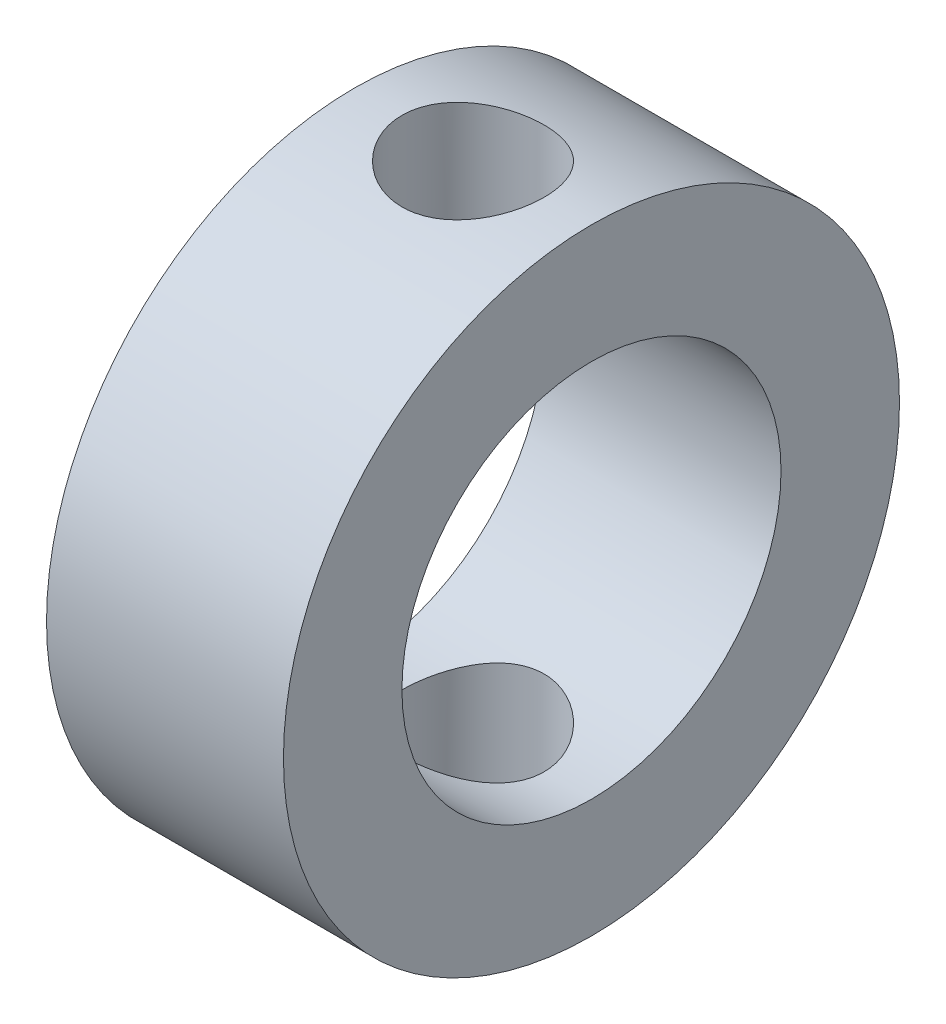
ISO-10303-21;
HEADER;
FILE_DESCRIPTION(('STEP AP214'),'2;1');
FILE_NAME('part.step','',(''),(''),'','','');
FILE_SCHEMA(('AUTOMOTIVE_DESIGN { 1 0 10303 214 1 1 1 1 }'));
ENDSEC;
DATA;
#1=APPLICATION_CONTEXT('core data for automotive mechanical design processes');
#2=APPLICATION_PROTOCOL_DEFINITION('international standard','automotive_design',2000,#1);
#3=PRODUCT_CONTEXT('',#1,'mechanical');
#4=PRODUCT('Part','Part','',(#3));
#5=PRODUCT_RELATED_PRODUCT_CATEGORY('part','',(#4));
#6=PRODUCT_DEFINITION_FORMATION('','',#4);
#7=PRODUCT_DEFINITION_CONTEXT('part definition',#1,'design');
#8=PRODUCT_DEFINITION('design','',#6,#7);
#9=PRODUCT_DEFINITION_SHAPE('','',#8);
#10=(LENGTH_UNIT() NAMED_UNIT(*) SI_UNIT(.MILLI.,.METRE.));
#11=(NAMED_UNIT(*) PLANE_ANGLE_UNIT() SI_UNIT($,.RADIAN.));
#12=(NAMED_UNIT(*) SI_UNIT($,.STERADIAN.) SOLID_ANGLE_UNIT());
#13=UNCERTAINTY_MEASURE_WITH_UNIT(LENGTH_MEASURE(1.E-05),#10,'distance_accuracy_value','');
#14=(GEOMETRIC_REPRESENTATION_CONTEXT(3) GLOBAL_UNCERTAINTY_ASSIGNED_CONTEXT((#13)) GLOBAL_UNIT_ASSIGNED_CONTEXT((#10,
#11,#12)) REPRESENTATION_CONTEXT('',''));
#15=CARTESIAN_POINT('',(0.,0.,0.));
#16=DIRECTION('',(0.,0.,1.));
#17=DIRECTION('',(1.,0.,0.));
#18=AXIS2_PLACEMENT_3D('',#15,#16,#17);
#19=CARTESIAN_POINT('',(5.,0.,0.));
#20=DIRECTION('',(1.,0.,0.));
#21=DIRECTION('',(0.,0.,-1.));
#22=AXIS2_PLACEMENT_3D('',#19,#20,#21);
#23=PLANE('',#22);
#24=CARTESIAN_POINT('',(5.,0.,0.));
#25=DIRECTION('',(1.,0.,0.));
#26=DIRECTION('',(0.,0.,-1.));
#27=AXIS2_PLACEMENT_3D('',#24,#25,#26);
#28=CIRCLE('',#27,13.);
#29=CARTESIAN_POINT('',(5.,0.,-13.));
#30=VERTEX_POINT('',#29);
#31=EDGE_CURVE('E10',#30,#30,#28,.T.);
#32=ORIENTED_EDGE('',*,*,#31,.T.);
#33=EDGE_LOOP('',(#32));
#34=FACE_BOUND('',#33,.T.);
#35=CARTESIAN_POINT('',(5.,0.,0.));
#36=DIRECTION('',(1.,0.,0.));
#37=DIRECTION('',(0.,0.,-1.));
#38=AXIS2_PLACEMENT_3D('',#35,#36,#37);
#39=CIRCLE('',#38,8.);
#40=CARTESIAN_POINT('',(5.,0.,-8.));
#41=VERTEX_POINT('',#40);
#42=EDGE_CURVE('E56',#41,#41,#39,.T.);
#43=ORIENTED_EDGE('',*,*,#42,.F.);
#44=EDGE_LOOP('',(#43));
#45=FACE_BOUND('',#44,.T.);
#46=ADVANCED_FACE('F37',(#34,#45),#23,.T.);
#47=CARTESIAN_POINT('',(-5.,0.,0.));
#48=DIRECTION('',(1.,0.,0.));
#49=DIRECTION('',(0.,0.,-1.));
#50=AXIS2_PLACEMENT_3D('',#47,#48,#49);
#51=PLANE('',#50);
#52=CARTESIAN_POINT('',(-5.,0.,0.));
#53=DIRECTION('',(1.,0.,0.));
#54=DIRECTION('',(0.,0.,-1.));
#55=AXIS2_PLACEMENT_3D('',#52,#53,#54);
#56=CIRCLE('',#55,13.);
#57=CARTESIAN_POINT('',(-5.,0.,-13.));
#58=VERTEX_POINT('',#57);
#59=EDGE_CURVE('E51',#58,#58,#56,.T.);
#60=ORIENTED_EDGE('',*,*,#59,.F.);
#61=EDGE_LOOP('',(#60));
#62=FACE_BOUND('',#61,.T.);
#63=CARTESIAN_POINT('',(-5.,0.,0.));
#64=DIRECTION('',(1.,0.,0.));
#65=DIRECTION('',(0.,0.,-1.));
#66=AXIS2_PLACEMENT_3D('',#63,#64,#65);
#67=CIRCLE('',#66,8.);
#68=CARTESIAN_POINT('',(-5.,0.,-8.));
#69=VERTEX_POINT('',#68);
#70=EDGE_CURVE('E59',#69,#69,#67,.T.);
#71=ORIENTED_EDGE('',*,*,#70,.T.);
#72=EDGE_LOOP('',(#71));
#73=FACE_BOUND('',#72,.T.);
#74=ADVANCED_FACE('F95',(#62,#73),#51,.F.);
#75=CARTESIAN_POINT('',(5.,0.,0.));
#76=DIRECTION('',(-1.,0.,0.));
#77=DIRECTION('',(0.,0.,1.));
#78=AXIS2_PLACEMENT_3D('',#75,#76,#77);
#79=CYLINDRICAL_SURFACE('',#78,13.);
#80=CARTESIAN_POINT('',(-3.,-13.,0.));
#81=CARTESIAN_POINT('',(-2.99999466928822,-12.9999969906573,0.166152344952669));
#82=CARTESIAN_POINT('',(-2.98615014637781,-12.9967824842909,0.332367205973653));
#83=CARTESIAN_POINT('',(-2.9312047142287,-12.9842700075106,0.660059866493254));
#84=CARTESIAN_POINT('',(-2.8900858231172,-12.9749680237034,0.821534467366725));
#85=CARTESIAN_POINT('',(-2.78196060211815,-12.9513142129353,1.13496480129888));
#86=CARTESIAN_POINT('',(-2.71498282973731,-12.936967958219,1.28693082086391));
#87=CARTESIAN_POINT('',(-2.55713546986327,-12.904766336637,1.577465910561));
#88=CARTESIAN_POINT('',(-2.46626596258808,-12.8869109815535,1.71603502567188));
#89=CARTESIAN_POINT('',(-2.26150949664556,-12.8492864660987,1.97830470624641));
#90=CARTESIAN_POINT('',(-2.14727927659515,-12.8294913730764,2.10173358432239));
#91=CARTESIAN_POINT('',(-1.89978014685718,-12.7903971901517,2.32786120795392));
#92=CARTESIAN_POINT('',(-1.76650938367844,-12.7710981487534,2.43055793299827));
#93=CARTESIAN_POINT('',(-1.48266614487996,-12.7349234835873,2.61353391505111));
#94=CARTESIAN_POINT('',(-1.33189911804872,-12.7180809816988,2.69351850955545));
#95=CARTESIAN_POINT('',(-1.01860980269649,-12.6891009206901,2.82690790660153));
#96=CARTESIAN_POINT('',(-0.856089095500931,-12.6769627300499,2.88031627708408));
#97=CARTESIAN_POINT('',(-0.526868396835623,-12.659030692131,2.95812848517193));
#98=CARTESIAN_POINT('',(-0.360288653266908,-12.6531311408672,2.98301618993589));
#99=CARTESIAN_POINT('',(-0.0252218259293469,-12.6480272975283,3.00458614092873));
#100=CARTESIAN_POINT('',(0.143264992556275,-12.6488220853967,3.00127226312641));
#101=CARTESIAN_POINT('',(0.47372561564872,-12.6569216667427,2.96692126571465));
#102=CARTESIAN_POINT('',(0.635762162688183,-12.6640932250769,2.93645150630372));
#103=CARTESIAN_POINT('',(0.952359583802943,-12.683927027642,2.8495548295868));
#104=CARTESIAN_POINT('',(1.10691999555408,-12.6965896109567,2.79312630925338));
#105=CARTESIAN_POINT('',(1.40574534328195,-12.726106644567,2.65540698150097));
#106=CARTESIAN_POINT('',(1.54990816182197,-12.7429968648251,2.57390258493056));
#107=CARTESIAN_POINT('',(1.82271847257873,-12.7790447936328,2.3884949795051));
#108=CARTESIAN_POINT('',(1.95136362051804,-12.7982028439228,2.28458839291061));
#109=CARTESIAN_POINT('',(2.19274790010195,-12.8371955528176,2.05434642172906));
#110=CARTESIAN_POINT('',(2.30502777024993,-12.8570353769547,1.92752990169011));
#111=CARTESIAN_POINT('',(2.50680614195071,-12.8947363213875,1.65663728210681));
#112=CARTESIAN_POINT('',(2.59630413509717,-12.91259739752,1.51256079749006));
#113=CARTESIAN_POINT('',(2.75011182828663,-12.94439708166,1.21064255594474));
#114=CARTESIAN_POINT('',(2.81435603138533,-12.9583254640484,1.0527662865885));
#115=CARTESIAN_POINT('',(2.9152722873901,-12.980615159728,0.728064792505166));
#116=CARTESIAN_POINT('',(2.95194881477694,-12.9889773764326,0.561241024748476));
#117=CARTESIAN_POINT('',(2.99600830069629,-12.999062058904,0.227314647863281));
#118=CARTESIAN_POINT('',(3.00401787211947,-13.0009265305377,0.0602988900254589));
#119=CARTESIAN_POINT('',(2.99222197048143,-12.9982059982626,-0.272684743158448));
#120=CARTESIAN_POINT('',(2.972418609864,-12.9936214841662,-0.438652697125492));
#121=CARTESIAN_POINT('',(2.90607760678847,-12.9786082469926,-0.762715807596045));
#122=CARTESIAN_POINT('',(2.85987351736574,-12.968252478837,-0.920882929751392));
#123=CARTESIAN_POINT('',(2.74241682215124,-12.9428582085761,-1.22721924496333));
#124=CARTESIAN_POINT('',(2.67116192372823,-12.9278192778858,-1.3753875214532));
#125=CARTESIAN_POINT('',(2.50435471215811,-12.8943799217624,-1.66007523022035));
#126=CARTESIAN_POINT('',(2.4084406162299,-12.8759307059183,-1.79637682059256));
#127=CARTESIAN_POINT('',(2.19550876528259,-12.8378078382851,-2.05117436096366));
#128=CARTESIAN_POINT('',(2.07848793691579,-12.8181340084537,-2.16966771329558));
#129=CARTESIAN_POINT('',(1.82377522824305,-12.7792809496474,-2.38800205666));
#130=CARTESIAN_POINT('',(1.68570607064937,-12.7601203499969,-2.48740687177955));
#131=CARTESIAN_POINT('',(1.39446823956527,-12.7249237700036,-2.66162470892947));
#132=CARTESIAN_POINT('',(1.24130023790751,-12.7088876507294,-2.73643882449717));
#133=CARTESIAN_POINT('',(0.925048023164728,-12.6819190230073,-2.85882133736006));
#134=CARTESIAN_POINT('',(0.76202774067897,-12.6709569224205,-2.90654808960746));
#135=CARTESIAN_POINT('',(0.429992014353496,-12.6553320099168,-2.9738506135118));
#136=CARTESIAN_POINT('',(0.260977661636089,-12.6506680575041,-2.99343148198756));
#137=CARTESIAN_POINT('',(-0.0738364541144734,-12.6482450687886,-3.00365072031913));
#138=CARTESIAN_POINT('',(-0.239614221299588,-12.6503205850391,-2.99498255743034));
#139=CARTESIAN_POINT('',(-0.567277357333891,-12.6607654071459,-2.95051371961671));
#140=CARTESIAN_POINT('',(-0.729162783214562,-12.6691346207273,-2.91471344248813));
#141=CARTESIAN_POINT('',(-1.04381982158291,-12.6911387833219,-2.81734841440311));
#142=CARTESIAN_POINT('',(-1.19662772141189,-12.7047508718617,-2.7558954206715));
#143=CARTESIAN_POINT('',(-1.48986361308248,-12.7357136622437,-2.60906164454194));
#144=CARTESIAN_POINT('',(-1.63029014825466,-12.7530648031611,-2.52367805163027));
#145=CARTESIAN_POINT('',(-1.8981710571802,-12.7900365874876,-2.32915359032528));
#146=CARTESIAN_POINT('',(-2.02526423909917,-12.8096993736488,-2.21952324066575));
#147=CARTESIAN_POINT('',(-2.25947649527657,-12.8488080487622,-1.98059542918642));
#148=CARTESIAN_POINT('',(-2.36659090986055,-12.8682538861233,-1.85129339204876));
#149=CARTESIAN_POINT('',(-2.55933453589763,-12.9050799859908,-1.57438386552311));
#150=CARTESIAN_POINT('',(-2.64462223657955,-12.9224254113505,-1.42653373816977));
#151=CARTESIAN_POINT('',(-2.78899829881722,-12.9527409110575,-1.11821928295074));
#152=CARTESIAN_POINT('',(-2.84810747020586,-12.9657144587282,-0.957765094203869));
#153=CARTESIAN_POINT('',(-2.92855694711147,-12.9836544679345,-0.664420748397536));
#154=CARTESIAN_POINT('',(-2.95529454205401,-12.989744579336,-0.533052734642017));
#155=CARTESIAN_POINT('',(-2.99101773322944,-12.9979184490222,-0.26780326056167));
#156=CARTESIAN_POINT('',(-3.00000429665468,-13.0000024255872,-0.133921937579661));
#157=CARTESIAN_POINT('',(-3.,-13.,0.));
#158=B_SPLINE_CURVE_WITH_KNOTS('',3,(#80,#81,#82,#83,#84,#85,#86,#87,#88,#89,#90,#91,#92,#93,
#94,#95,#96,#97,#98,#99,#100,#101,#102,#103,#104,#105,#106,#107,#108,#109,#110,#111,#112,#113,
#114,#115,#116,#117,#118,#119,#120,#121,#122,#123,#124,#125,#126,#127,#128,#129,#130,#131,#132,
#133,#134,#135,#136,#137,#138,#139,#140,#141,#142,#143,#144,#145,#146,#147,#148,#149,#150,#151,
#152,#153,#154,#155,#156,#157),.UNSPECIFIED.,.T.,.F.,(4,2,2,2,2,2,2,2,2,2,2,2,2,2,2,2,2,2,2,2,2,
2,2,2,2,2,2,2,2,2,2,2,2,2,2,2,2,2,4),(0.,0.497966622434228,0.996261878862196,1.49400840494549,
1.9917532598344,2.49741860444443,3.00313320634928,3.51513680218821,4.02707164139241,
4.53018632285288,5.03323185836015,5.52600755521466,6.01881368645778,6.51593939429341,
7.01314010983494,7.52235052563831,8.03157230411895,8.54210619550815,9.05255720476822,
9.55178002870642,10.0509649377955,10.5439782351977,11.0370366645577,11.5377886750691,
12.0386136589454,12.5497908111456,13.0609452284513,13.5690797726974,14.0771222894149,
14.5727880288599,15.0684465012649,15.5619677862172,16.0555470567626,16.5601864742807,
17.0649434427466,17.5771721946325,18.088993031651,18.4903854337741,18.8917559648093),.UNSPECIFIED.);
#159=CARTESIAN_POINT('',(-3.,-13.,0.));
#160=VERTEX_POINT('',#159);
#161=EDGE_CURVE('E84',#160,#160,#158,.T.);
#162=ORIENTED_EDGE('',*,*,#161,.T.);
#163=EDGE_LOOP('',(#162));
#164=FACE_BOUND('',#163,.T.);
#165=CARTESIAN_POINT('',(0.,12.6491106406735,3.));
#166=CARTESIAN_POINT('',(-0.166085929631423,12.6491139729391,2.9999946245021));
#167=CARTESIAN_POINT('',(-0.332234480438236,12.6524174299822,2.98616079030694));
#168=CARTESIAN_POINT('',(-0.659789524168164,12.6652465923009,2.93126165669304));
#169=CARTESIAN_POINT('',(-0.821192762378775,12.674776468694,2.89017810223513));
#170=CARTESIAN_POINT('',(-1.1344718385608,12.6989229865282,2.78215616244894));
#171=CARTESIAN_POINT('',(-1.28635856884149,12.713533682283,2.71524798764163));
#172=CARTESIAN_POINT('',(-1.57675960688868,12.7461883447142,2.5575647638114));
#173=CARTESIAN_POINT('',(-1.7152738730261,12.764232322078,2.46678964049286));
#174=CARTESIAN_POINT('',(-1.97760045439382,12.8020993500835,2.26213062702366));
#175=CARTESIAN_POINT('',(-2.10112486112244,12.8219473065538,2.1478822444478));
#176=CARTESIAN_POINT('',(-2.32743828910303,12.860968641196,1.90030604476977));
#177=CARTESIAN_POINT('',(-2.43022558264671,12.8801419630512,1.76697663951672));
#178=CARTESIAN_POINT('',(-2.61330044090427,12.915926594876,1.48307705159748));
#179=CARTESIAN_POINT('',(-2.69330887773861,12.9325050857704,1.33232237777388));
#180=CARTESIAN_POINT('',(-2.82674570016033,12.9609497350116,1.01905965401954));
#181=CARTESIAN_POINT('',(-2.88017741296539,12.9728164831977,0.856553078262878));
#182=CARTESIAN_POINT('',(-2.95803232778329,12.990324560775,0.527396276574475));
#183=CARTESIAN_POINT('',(-2.98294344750448,12.9960704797887,0.360867114923413));
#184=CARTESIAN_POINT('',(-3.00457778732886,13.0010526406593,0.025900857224082));
#185=CARTESIAN_POINT('',(-3.00130458135734,13.000289707874,-0.14253599421368));
#186=CARTESIAN_POINT('',(-2.96702196732382,12.9924192928671,-0.473165243537533));
#187=CARTESIAN_POINT('',(-2.93653873676739,12.9854321768116,-0.635415490640889));
#188=CARTESIAN_POINT('',(-2.84954254934584,12.9660366959477,-0.952433164284376));
#189=CARTESIAN_POINT('',(-2.79302833205869,12.9536280686309,-1.10720022808729));
#190=CARTESIAN_POINT('',(-2.65512384974174,12.9245937060633,-1.40629128250779));
#191=CARTESIAN_POINT('',(-2.57353868419991,12.9079351104055,-1.55052208796757));
#192=CARTESIAN_POINT('',(-2.38795441363139,12.8722203152567,-1.82343497204499));
#193=CARTESIAN_POINT('',(-2.28395193624399,12.8531637552062,-1.95211470667813));
#194=CARTESIAN_POINT('',(-2.05363649369272,12.8142215416329,-2.1934058842547));
#195=CARTESIAN_POINT('',(-1.9268631755413,12.7943269062359,-2.30557688423932));
#196=CARTESIAN_POINT('',(-1.65609753557402,12.7563601191761,-2.50715545224223));
#197=CARTESIAN_POINT('',(-1.51210463385656,12.7382880289286,-2.5965622533162));
#198=CARTESIAN_POINT('',(-1.21021948591181,12.7059853658082,-2.75030147334197));
#199=CARTESIAN_POINT('',(-1.05227898482501,12.6917688823564,-2.81454229910148));
#200=CARTESIAN_POINT('',(-0.727436445551809,12.6689761200522,-2.91543265644024));
#201=CARTESIAN_POINT('',(-0.5605360145308,12.6603988333148,-2.95208711865724));
#202=CARTESIAN_POINT('',(-0.226558159990292,12.6500634806979,-2.99606364387658));
#203=CARTESIAN_POINT('',(-0.0595702024603049,12.6481554983084,-3.00403068516923));
#204=CARTESIAN_POINT('',(0.273348074485397,12.6509690118016,-2.99215969056544));
#205=CARTESIAN_POINT('',(0.439278474528389,12.6556899960744,-2.97232380044158));
#206=CARTESIAN_POINT('',(0.763071090433347,12.6710871477522,-2.90597189831615));
#207=CARTESIAN_POINT('',(0.921011837610108,12.6816823107987,-2.85981855993657));
#208=CARTESIAN_POINT('',(1.2269175658547,12.7075595201458,-2.7425380227221));
#209=CARTESIAN_POINT('',(1.37488150315387,12.7228420559117,-2.67140821567947));
#210=CARTESIAN_POINT('',(1.65940307375868,12.7566963286292,-2.50479935819412));
#211=CARTESIAN_POINT('',(1.79572432902241,12.775319516353,-2.40892731507744));
#212=CARTESIAN_POINT('',(2.0505807258662,12.8136246309507,-2.19606317641424));
#213=CARTESIAN_POINT('',(2.1691133915019,12.833306704691,-2.07906814580117));
#214=CARTESIAN_POINT('',(2.38757162939904,12.8720112725971,-1.82434490857929));
#215=CARTESIAN_POINT('',(2.4870550442548,12.8910112902544,-1.68623348016341));
#216=CARTESIAN_POINT('',(2.66141080499818,12.9257797692582,-1.39488634866838));
#217=CARTESIAN_POINT('',(2.73628436262695,12.9415483896978,-1.24165139072541));
#218=CARTESIAN_POINT('',(2.85869947583708,12.9679835289197,-0.925410504785927));
#219=CARTESIAN_POINT('',(2.90642440056004,12.9786841937062,-0.762478543893018));
#220=CARTESIAN_POINT('',(2.97375303694443,12.9939261237968,-0.430632225011116));
#221=CARTESIAN_POINT('',(2.99336132667247,12.99846839183,-0.261718845531955));
#222=CARTESIAN_POINT('',(3.00367490456574,13.0008478161074,0.0731147580789179));
#223=CARTESIAN_POINT('',(2.99503739400405,12.9988374378214,0.239013989351583));
#224=CARTESIAN_POINT('',(2.95058762898656,12.9886683469743,0.566928369656014));
#225=CARTESIAN_POINT('',(2.91477597456981,12.980509770173,0.728943604369786));
#226=CARTESIAN_POINT('',(2.81732403683244,12.9589769318438,1.04391562233924));
#227=CARTESIAN_POINT('',(2.75578656979891,12.9456234469743,1.19690572846382));
#228=CARTESIAN_POINT('',(2.60872663708603,12.9151190396146,1.49047181383704));
#229=CARTESIAN_POINT('',(2.52320156923543,12.8979677051768,1.63104644408015));
#230=CARTESIAN_POINT('',(2.32850248790651,12.8612836290516,1.89896480731369));
#231=CARTESIAN_POINT('',(2.21887215854183,12.8417086566635,2.0259711704593));
#232=CARTESIAN_POINT('',(1.9799824228948,12.8025963604477,2.26000832156021));
#233=CARTESIAN_POINT('',(1.85071821408086,12.7830590470187,2.36703420788799));
#234=CARTESIAN_POINT('',(1.57385603874387,12.7458991234253,2.5596581660751));
#235=CARTESIAN_POINT('',(1.42600839044305,12.7283102829991,2.64490430932249));
#236=CARTESIAN_POINT('',(1.11770431683566,12.6974733667531,2.78920331982028));
#237=CARTESIAN_POINT('',(0.957258142554757,12.6842218062867,2.84827722786392));
#238=CARTESIAN_POINT('',(0.664001762109058,12.6658719164676,2.92864765692709));
#239=CARTESIAN_POINT('',(0.532718279463819,12.6596301542599,2.95535096878448));
#240=CARTESIAN_POINT('',(0.267636650881184,12.6512482980183,2.99102876898443));
#241=CARTESIAN_POINT('',(0.133838657842301,12.6491079554012,3.00000433179033));
#242=CARTESIAN_POINT('',(0.,12.6491106406735,3.));
#243=B_SPLINE_CURVE_WITH_KNOTS('',3,(#165,#166,#167,#168,#169,#170,#171,#172,#173,#174,#175,
#176,#177,#178,#179,#180,#181,#182,#183,#184,#185,#186,#187,#188,#189,#190,#191,#192,#193,#194,
#195,#196,#197,#198,#199,#200,#201,#202,#203,#204,#205,#206,#207,#208,#209,#210,#211,#212,#213,
#214,#215,#216,#217,#218,#219,#220,#221,#222,#223,#224,#225,#226,#227,#228,#229,#230,#231,#232,
#233,#234,#235,#236,#237,#238,#239,#240,#241,#242),.UNSPECIFIED.,.T.,.F.,(4,2,2,2,2,2,2,2,2,2,2,
2,2,2,2,2,2,2,2,2,2,2,2,2,2,2,2,2,2,2,2,2,2,2,2,2,2,2,4),(0.,0.497766931606995,
0.995867662786753,1.49338745625111,1.99090879846697,2.49683528598289,3.00280390726787,
3.51472913247548,4.02659025212784,4.52955730661948,5.0324605831014,5.52584465394859,
6.01925261699573,6.51659773888752,7.01401773145073,7.52294169566517,8.03188280367244,
8.54265939854458,9.05334467826895,9.55247393504074,10.0515646721731,10.5439382810322,
11.0363633220925,11.5371508785039,12.0380080736258,12.549364908912,13.0606965622168,
13.5685322375916,14.0762852156718,14.5723090071665,15.068321846155,15.56237098086,
16.0564737306814,16.5608887352403,17.0654273211741,17.5776655194299,18.0894911605436,
18.4906358954932,18.8917563166655),.UNSPECIFIED.);
#244=CARTESIAN_POINT('',(0.,12.6491106406735,3.));
#245=VERTEX_POINT('',#244);
#246=EDGE_CURVE('E79',#245,#245,#243,.T.);
#247=ORIENTED_EDGE('',*,*,#246,.T.);
#248=EDGE_LOOP('',(#247));
#249=FACE_BOUND('',#248,.T.);
#250=ORIENTED_EDGE('',*,*,#31,.F.);
#251=EDGE_LOOP('',(#250));
#252=FACE_BOUND('',#251,.T.);
#253=ORIENTED_EDGE('',*,*,#59,.T.);
#254=EDGE_LOOP('',(#253));
#255=FACE_BOUND('',#254,.T.);
#256=ADVANCED_FACE('F39',(#164,#249,#252,#255),#79,.T.);
#257=CARTESIAN_POINT('',(5.,0.,0.));
#258=DIRECTION('',(-1.,0.,0.));
#259=DIRECTION('',(0.,0.,1.));
#260=AXIS2_PLACEMENT_3D('',#257,#258,#259);
#261=CYLINDRICAL_SURFACE('',#260,8.);
#262=CARTESIAN_POINT('',(0.,-7.41619848709566,3.));
#263=CARTESIAN_POINT('',(0.162014967483405,-7.41619281215226,3.00000608211288));
#264=CARTESIAN_POINT('',(0.323989845126192,-7.42156520296313,2.98683195095364));
#265=CARTESIAN_POINT('',(0.643056165935218,-7.44232318425766,2.93472375787483));
#266=CARTESIAN_POINT('',(0.800147755211684,-7.45770847484803,2.89579046745932));
#267=CARTESIAN_POINT('',(1.10475074318883,-7.49650960610891,2.79379315222297));
#268=CARTESIAN_POINT('',(1.25228411329191,-7.51990619151696,2.73078694533005));
#269=CARTESIAN_POINT('',(1.53474379364794,-7.57206268400018,2.58263713485087));
#270=CARTESIAN_POINT('',(1.66966630056785,-7.60082420131042,2.49748688189993));
#271=CARTESIAN_POINT('',(1.9297806232427,-7.66207149335192,2.30293322748412));
#272=CARTESIAN_POINT('',(2.054257059258,-7.69466683848217,2.19260762426636));
#273=CARTESIAN_POINT('',(2.28344562934377,-7.75899501256083,1.95279167955762));
#274=CARTESIAN_POINT('',(2.38815354748392,-7.79072765629295,1.82329726051329));
#275=CARTESIAN_POINT('',(2.578279024591,-7.8510574787339,1.54338931035527));
#276=CARTESIAN_POINT('',(2.66291894943166,-7.87951122447087,1.39241389507607));
#277=CARTESIAN_POINT('',(2.80530234504988,-7.92876015947619,1.07711154393048));
#278=CARTESIAN_POINT('',(2.86305514398396,-7.94955800433994,0.912789261867065));
#279=CARTESIAN_POINT('',(2.94751579154922,-7.98037394206897,0.582978683353668));
#280=CARTESIAN_POINT('',(2.97545525488092,-7.99081830429549,0.417846394563196));
#281=CARTESIAN_POINT('',(3.00344240188998,-8.0012802821588,0.0849287275895659));
#282=CARTESIAN_POINT('',(3.0034991552374,-8.0013012882982,-0.082855770125681));
#283=CARTESIAN_POINT('',(2.97643647706967,-7.99118531807773,-0.407487086128941));
#284=CARTESIAN_POINT('',(2.95066140410244,-7.98155083993306,-0.564464356533757));
#285=CARTESIAN_POINT('',(2.87492816954882,-7.95386549864585,-0.87167843596883));
#286=CARTESIAN_POINT('',(2.82496829547565,-7.93581403951378,-1.02191476686077));
#287=CARTESIAN_POINT('',(2.70165909664858,-7.89275538334835,-1.31397803460604));
#288=CARTESIAN_POINT('',(2.62797998946421,-7.86765078939303,-1.45565078457398));
#289=CARTESIAN_POINT('',(2.4596158061402,-7.81302620451409,-1.72497321591576));
#290=CARTESIAN_POINT('',(2.36492395396096,-7.78350479028858,-1.85261835386705));
#291=CARTESIAN_POINT('',(2.15074542743768,-7.72105059308269,-2.09818097359933));
#292=CARTESIAN_POINT('',(2.03013216871469,-7.68801927514871,-2.21509229051721));
#293=CARTESIAN_POINT('',(1.77081401334133,-7.62364921304341,-2.42740791139661));
#294=CARTESIAN_POINT('',(1.63210458676857,-7.59231089545926,-2.52280681389449));
#295=CARTESIAN_POINT('',(1.33656106512264,-7.53425406951149,-2.69131223613209));
#296=CARTESIAN_POINT('',(1.17939301282854,-7.50765354114235,-2.76387695690677));
#297=CARTESIAN_POINT('',(0.853807549872233,-7.4634487707231,-2.88112928869848));
#298=CARTESIAN_POINT('',(0.685396456874292,-7.44583952363152,-2.925832412077));
#299=CARTESIAN_POINT('',(0.352048075324514,-7.42279194491541,-2.98380383422379));
#300=CARTESIAN_POINT('',(0.18743178891606,-7.41673570495336,-2.99867042318746));
#301=CARTESIAN_POINT('',(-0.142018713471833,-7.41573079037772,-3.00115771271731));
#302=CARTESIAN_POINT('',(-0.30685286470189,-7.42077934004762,-2.9887852218731));
#303=CARTESIAN_POINT('',(-0.623859844578269,-7.44078763262529,-2.93859467040517));
#304=CARTESIAN_POINT('',(-0.776262271530102,-7.45526552433718,-2.90201236668503));
#305=CARTESIAN_POINT('',(-1.07269588943961,-7.49192974091902,-2.80599549281221));
#306=CARTESIAN_POINT('',(-1.21672535833606,-7.51411764500121,-2.74655624069231));
#307=CARTESIAN_POINT('',(-1.49832887615263,-7.56472486232391,-2.60400584550571));
#308=CARTESIAN_POINT('',(-1.63545858427474,-7.59334657784192,-2.52009090354098));
#309=CARTESIAN_POINT('',(-1.89425796345202,-7.6532562858852,-2.33182635724954));
#310=CARTESIAN_POINT('',(-2.01592194924925,-7.68454525188137,-2.22746927392868));
#311=CARTESIAN_POINT('',(-2.24833674639021,-7.74866093106386,-1.99345468180189));
#312=CARTESIAN_POINT('',(-2.35790681753751,-7.7814593871406,-1.86261268298213));
#313=CARTESIAN_POINT('',(-2.55367673517887,-7.84299749926599,-1.5835949435063));
#314=CARTESIAN_POINT('',(-2.63987650589168,-7.87173714215327,-1.43541914664534));
#315=CARTESIAN_POINT('',(-2.78589211239923,-7.92189971409105,-1.12603265893695));
#316=CARTESIAN_POINT('',(-2.84579824758521,-7.9433476267602,-0.964868866129253));
#317=CARTESIAN_POINT('',(-2.93731282769984,-7.97658873425142,-0.633763775046509));
#318=CARTESIAN_POINT('',(-2.9689345708448,-7.98838646598825,-0.463826641447185));
#319=CARTESIAN_POINT('',(-3.00154880550965,-8.00056814634147,-0.130671170547631));
#320=CARTESIAN_POINT('',(-3.00421896611798,-8.00157721907528,0.0323615361216899));
#321=CARTESIAN_POINT('',(-2.98316968110921,-7.99369779618447,0.356453572824847));
#322=CARTESIAN_POINT('',(-2.95945341822829,-7.98481049426262,0.517513138490514));
#323=CARTESIAN_POINT('',(-2.88748229701276,-7.95842179207541,0.829096496754252));
#324=CARTESIAN_POINT('',(-2.83984018824329,-7.9411358275603,0.979781462137668));
#325=CARTESIAN_POINT('',(-2.72197997323128,-7.89975567241984,1.27103094601278));
#326=CARTESIAN_POINT('',(-2.6517575933905,-7.87566019311345,1.41159354255109));
#327=CARTESIAN_POINT('',(-2.48737211299037,-7.8218123660013,1.68508035398882));
#328=CARTESIAN_POINT('',(-2.39232671897167,-7.79186480217587,1.81743509769369));
#329=CARTESIAN_POINT('',(-2.18238433962482,-7.72999015389759,2.06483469504674));
#330=CARTESIAN_POINT('',(-2.06748026838437,-7.69806236548317,2.17987334251184));
#331=CARTESIAN_POINT('',(-1.81387173670976,-7.63376259478074,2.39562428472386));
#332=CARTESIAN_POINT('',(-1.67423119569092,-7.60145610697262,2.49525999632032));
#333=CARTESIAN_POINT('',(-1.37916826085381,-7.54196650008334,2.66969419113705));
#334=CARTESIAN_POINT('',(-1.22374423189476,-7.51478391266386,2.74449009756384));
#335=CARTESIAN_POINT('',(-0.894088638047392,-7.46804539702406,2.86931773948447));
#336=CARTESIAN_POINT('',(-0.719331266969587,-7.44887606566003,2.91812005798766));
#337=CARTESIAN_POINT('',(-0.363029456095265,-7.42295988688337,2.98344713444437));
#338=CARTESIAN_POINT('',(-0.18148957460557,-7.41620484418155,2.99999318680184));
#339=CARTESIAN_POINT('',(0.,-7.41619848709566,3.));
#340=B_SPLINE_CURVE_WITH_KNOTS('',3,(#262,#263,#264,#265,#266,#267,#268,#269,#270,#271,#272,
#273,#274,#275,#276,#277,#278,#279,#280,#281,#282,#283,#284,#285,#286,#287,#288,#289,#290,#291,
#292,#293,#294,#295,#296,#297,#298,#299,#300,#301,#302,#303,#304,#305,#306,#307,#308,#309,#310,
#311,#312,#313,#314,#315,#316,#317,#318,#319,#320,#321,#322,#323,#324,#325,#326,#327,#328,#329,
#330,#331,#332,#333,#334,#335,#336,#337,#338,#339),.UNSPECIFIED.,.T.,.F.,(4,2,2,2,2,2,2,2,2,2,2,
2,2,2,2,2,2,2,2,2,2,2,2,2,2,2,2,2,2,2,2,2,2,2,2,2,2,2,4),(0.,0.485369082889299,0.97072362930767,
1.45491971362402,1.93926135947583,2.44549304813252,2.95183257656962,3.47540144283838,
3.99878852773656,4.49960036990354,5.00024930820711,5.47612945617385,5.95204330537667,
6.43488262432332,6.91787787268948,7.42913350142745,7.94051735665666,8.46325184520833,
8.98569503290589,9.47931315500611,9.97280790797409,10.4428769187604,10.9130422687869,
11.4008312203128,11.8887989695235,12.4077003400689,12.9266033932,13.4437101779998,
13.9605737113989,14.4473144111951,14.933996406586,15.4088054802742,15.883704470453,
16.3785664737361,16.8736054180957,17.394771991038,17.9159926110813,18.4600635776149,
19.0037752466575),.UNSPECIFIED.);
#341=CARTESIAN_POINT('',(0.,-7.41619848709566,3.));
#342=VERTEX_POINT('',#341);
#343=EDGE_CURVE('E42',#342,#342,#340,.T.);
#344=ORIENTED_EDGE('',*,*,#343,.F.);
#345=EDGE_LOOP('',(#344));
#346=FACE_BOUND('',#345,.T.);
#347=CARTESIAN_POINT('',(0.,7.41619848709566,3.));
#348=CARTESIAN_POINT('',(-0.162014967483405,7.41619281215226,3.00000608211288));
#349=CARTESIAN_POINT('',(-0.323989845126192,7.42156520296313,2.98683195095364));
#350=CARTESIAN_POINT('',(-0.643056165935218,7.44232318425766,2.93472375787483));
#351=CARTESIAN_POINT('',(-0.800147755211684,7.45770847484803,2.89579046745932));
#352=CARTESIAN_POINT('',(-1.10475074318883,7.49650960610891,2.79379315222297));
#353=CARTESIAN_POINT('',(-1.25228411329191,7.51990619151696,2.73078694533005));
#354=CARTESIAN_POINT('',(-1.53474379364794,7.57206268400018,2.58263713485087));
#355=CARTESIAN_POINT('',(-1.66966630056785,7.60082420131042,2.49748688189993));
#356=CARTESIAN_POINT('',(-1.9297806232427,7.66207149335192,2.30293322748412));
#357=CARTESIAN_POINT('',(-2.054257059258,7.69466683848217,2.19260762426636));
#358=CARTESIAN_POINT('',(-2.28344562934377,7.75899501256083,1.95279167955762));
#359=CARTESIAN_POINT('',(-2.38815354748392,7.79072765629295,1.82329726051329));
#360=CARTESIAN_POINT('',(-2.578279024591,7.8510574787339,1.54338931035527));
#361=CARTESIAN_POINT('',(-2.66291894943166,7.87951122447087,1.39241389507607));
#362=CARTESIAN_POINT('',(-2.80530234504988,7.92876015947619,1.07711154393048));
#363=CARTESIAN_POINT('',(-2.86305514398396,7.94955800433994,0.912789261867065));
#364=CARTESIAN_POINT('',(-2.94751579154922,7.98037394206897,0.582978683353668));
#365=CARTESIAN_POINT('',(-2.97545525488092,7.99081830429549,0.417846394563196));
#366=CARTESIAN_POINT('',(-3.00344240188998,8.0012802821588,0.0849287275895659));
#367=CARTESIAN_POINT('',(-3.0034991552374,8.0013012882982,-0.082855770125681));
#368=CARTESIAN_POINT('',(-2.97643647706967,7.99118531807773,-0.407487086128941));
#369=CARTESIAN_POINT('',(-2.95066140410244,7.98155083993306,-0.564464356533757));
#370=CARTESIAN_POINT('',(-2.87492816954882,7.95386549864585,-0.87167843596883));
#371=CARTESIAN_POINT('',(-2.82496829547565,7.93581403951378,-1.02191476686077));
#372=CARTESIAN_POINT('',(-2.70165909664858,7.89275538334835,-1.31397803460604));
#373=CARTESIAN_POINT('',(-2.62797998946421,7.86765078939303,-1.45565078457398));
#374=CARTESIAN_POINT('',(-2.4596158061402,7.81302620451409,-1.72497321591576));
#375=CARTESIAN_POINT('',(-2.36492395396096,7.78350479028858,-1.85261835386705));
#376=CARTESIAN_POINT('',(-2.15074542743768,7.72105059308269,-2.09818097359933));
#377=CARTESIAN_POINT('',(-2.03013216871469,7.68801927514871,-2.21509229051721));
#378=CARTESIAN_POINT('',(-1.77081401334133,7.62364921304341,-2.42740791139661));
#379=CARTESIAN_POINT('',(-1.63210458676857,7.59231089545926,-2.52280681389449));
#380=CARTESIAN_POINT('',(-1.33656106512264,7.53425406951149,-2.69131223613209));
#381=CARTESIAN_POINT('',(-1.17939301282854,7.50765354114235,-2.76387695690677));
#382=CARTESIAN_POINT('',(-0.853807549872233,7.4634487707231,-2.88112928869848));
#383=CARTESIAN_POINT('',(-0.685396456874292,7.44583952363152,-2.925832412077));
#384=CARTESIAN_POINT('',(-0.352048075324514,7.42279194491541,-2.98380383422379));
#385=CARTESIAN_POINT('',(-0.18743178891606,7.41673570495336,-2.99867042318746));
#386=CARTESIAN_POINT('',(0.142018713471833,7.41573079037772,-3.00115771271731));
#387=CARTESIAN_POINT('',(0.30685286470189,7.42077934004762,-2.9887852218731));
#388=CARTESIAN_POINT('',(0.623859844578269,7.44078763262529,-2.93859467040517));
#389=CARTESIAN_POINT('',(0.776262271530102,7.45526552433718,-2.90201236668503));
#390=CARTESIAN_POINT('',(1.07269588943961,7.49192974091902,-2.80599549281221));
#391=CARTESIAN_POINT('',(1.21672535833606,7.51411764500121,-2.74655624069231));
#392=CARTESIAN_POINT('',(1.49832887615263,7.56472486232391,-2.60400584550571));
#393=CARTESIAN_POINT('',(1.63545858427474,7.59334657784192,-2.52009090354098));
#394=CARTESIAN_POINT('',(1.89425796345202,7.6532562858852,-2.33182635724954));
#395=CARTESIAN_POINT('',(2.01592194924925,7.68454525188137,-2.22746927392868));
#396=CARTESIAN_POINT('',(2.24833674639021,7.74866093106386,-1.99345468180189));
#397=CARTESIAN_POINT('',(2.35790681753751,7.7814593871406,-1.86261268298213));
#398=CARTESIAN_POINT('',(2.55367673517887,7.84299749926599,-1.5835949435063));
#399=CARTESIAN_POINT('',(2.63987650589168,7.87173714215327,-1.43541914664534));
#400=CARTESIAN_POINT('',(2.78589211239923,7.92189971409105,-1.12603265893695));
#401=CARTESIAN_POINT('',(2.84579824758521,7.9433476267602,-0.964868866129253));
#402=CARTESIAN_POINT('',(2.93731282769984,7.97658873425142,-0.633763775046509));
#403=CARTESIAN_POINT('',(2.9689345708448,7.98838646598825,-0.463826641447185));
#404=CARTESIAN_POINT('',(3.00154880550965,8.00056814634147,-0.130671170547631));
#405=CARTESIAN_POINT('',(3.00421896611798,8.00157721907528,0.0323615361216899));
#406=CARTESIAN_POINT('',(2.98316968110921,7.99369779618447,0.356453572824847));
#407=CARTESIAN_POINT('',(2.95945341822829,7.98481049426262,0.517513138490514));
#408=CARTESIAN_POINT('',(2.88748229701276,7.95842179207541,0.829096496754252));
#409=CARTESIAN_POINT('',(2.83984018824329,7.9411358275603,0.979781462137668));
#410=CARTESIAN_POINT('',(2.72197997323128,7.89975567241984,1.27103094601278));
#411=CARTESIAN_POINT('',(2.6517575933905,7.87566019311345,1.41159354255109));
#412=CARTESIAN_POINT('',(2.48737211299037,7.8218123660013,1.68508035398882));
#413=CARTESIAN_POINT('',(2.39232671897167,7.79186480217587,1.81743509769369));
#414=CARTESIAN_POINT('',(2.18238433962482,7.72999015389759,2.06483469504674));
#415=CARTESIAN_POINT('',(2.06748026838437,7.69806236548317,2.17987334251184));
#416=CARTESIAN_POINT('',(1.81387173670976,7.63376259478074,2.39562428472386));
#417=CARTESIAN_POINT('',(1.67423119569092,7.60145610697262,2.49525999632032));
#418=CARTESIAN_POINT('',(1.37916826085381,7.54196650008334,2.66969419113705));
#419=CARTESIAN_POINT('',(1.22374423189476,7.51478391266386,2.74449009756384));
#420=CARTESIAN_POINT('',(0.894088638047392,7.46804539702406,2.86931773948447));
#421=CARTESIAN_POINT('',(0.719331266969587,7.44887606566003,2.91812005798766));
#422=CARTESIAN_POINT('',(0.363029456095265,7.42295988688337,2.98344713444437));
#423=CARTESIAN_POINT('',(0.18148957460557,7.41620484418155,2.99999318680184));
#424=CARTESIAN_POINT('',(0.,7.41619848709566,3.));
#425=B_SPLINE_CURVE_WITH_KNOTS('',3,(#347,#348,#349,#350,#351,#352,#353,#354,#355,#356,#357,
#358,#359,#360,#361,#362,#363,#364,#365,#366,#367,#368,#369,#370,#371,#372,#373,#374,#375,#376,
#377,#378,#379,#380,#381,#382,#383,#384,#385,#386,#387,#388,#389,#390,#391,#392,#393,#394,#395,
#396,#397,#398,#399,#400,#401,#402,#403,#404,#405,#406,#407,#408,#409,#410,#411,#412,#413,#414,
#415,#416,#417,#418,#419,#420,#421,#422,#423,#424),.UNSPECIFIED.,.T.,.F.,(4,2,2,2,2,2,2,2,2,2,2,
2,2,2,2,2,2,2,2,2,2,2,2,2,2,2,2,2,2,2,2,2,2,2,2,2,2,2,4),(0.,0.485369082889299,0.97072362930767,
1.45491971362402,1.93926135947583,2.44549304813252,2.95183257656962,3.47540144283838,
3.99878852773656,4.49960036990354,5.00024930820711,5.47612945617385,5.95204330537667,
6.43488262432332,6.91787787268948,7.42913350142745,7.94051735665666,8.46325184520833,
8.98569503290589,9.47931315500611,9.97280790797409,10.4428769187604,10.9130422687869,
11.4008312203128,11.8887989695235,12.4077003400689,12.9266033932,13.4437101779998,
13.9605737113989,14.4473144111951,14.933996406586,15.4088054802742,15.883704470453,
16.3785664737361,16.8736054180957,17.394771991038,17.9159926110813,18.4600635776149,
19.0037752466575),.UNSPECIFIED.);
#426=CARTESIAN_POINT('',(0.,7.41619848709566,3.));
#427=VERTEX_POINT('',#426);
#428=EDGE_CURVE('E61',#427,#427,#425,.T.);
#429=ORIENTED_EDGE('',*,*,#428,.F.);
#430=EDGE_LOOP('',(#429));
#431=FACE_BOUND('',#430,.T.);
#432=ORIENTED_EDGE('',*,*,#42,.T.);
#433=EDGE_LOOP('',(#432));
#434=FACE_BOUND('',#433,.T.);
#435=ORIENTED_EDGE('',*,*,#70,.F.);
#436=EDGE_LOOP('',(#435));
#437=FACE_BOUND('',#436,.T.);
#438=ADVANCED_FACE('F66',(#346,#431,#434,#437),#261,.F.);
#439=CARTESIAN_POINT('',(0.,-13.,0.));
#440=DIRECTION('',(0.,1.,0.));
#441=DIRECTION('',(0.,0.,1.));
#442=AXIS2_PLACEMENT_3D('',#439,#440,#441);
#443=CYLINDRICAL_SURFACE('',#442,3.);
#444=ORIENTED_EDGE('',*,*,#428,.T.);
#445=EDGE_LOOP('',(#444));
#446=FACE_BOUND('',#445,.T.);
#447=ORIENTED_EDGE('',*,*,#246,.F.);
#448=EDGE_LOOP('',(#447));
#449=FACE_BOUND('',#448,.T.);
#450=ADVANCED_FACE('F72',(#446,#449),#443,.F.);
#451=ORIENTED_EDGE('',*,*,#343,.T.);
#452=EDGE_LOOP('',(#451));
#453=FACE_BOUND('',#452,.T.);
#454=ORIENTED_EDGE('',*,*,#161,.F.);
#455=EDGE_LOOP('',(#454));
#456=FACE_BOUND('',#455,.T.);
#457=ADVANCED_FACE('F69',(#453,#456),#443,.F.);
#458=CLOSED_SHELL('',(#46,#74,#256,#438,#450,#457));
#459=MANIFOLD_SOLID_BREP('B2',#458);
#460=ADVANCED_BREP_SHAPE_REPRESENTATION('',(#18,#459),#14);
#461=SHAPE_DEFINITION_REPRESENTATION(#9,#460);
ENDSEC;
END-ISO-10303-21;
